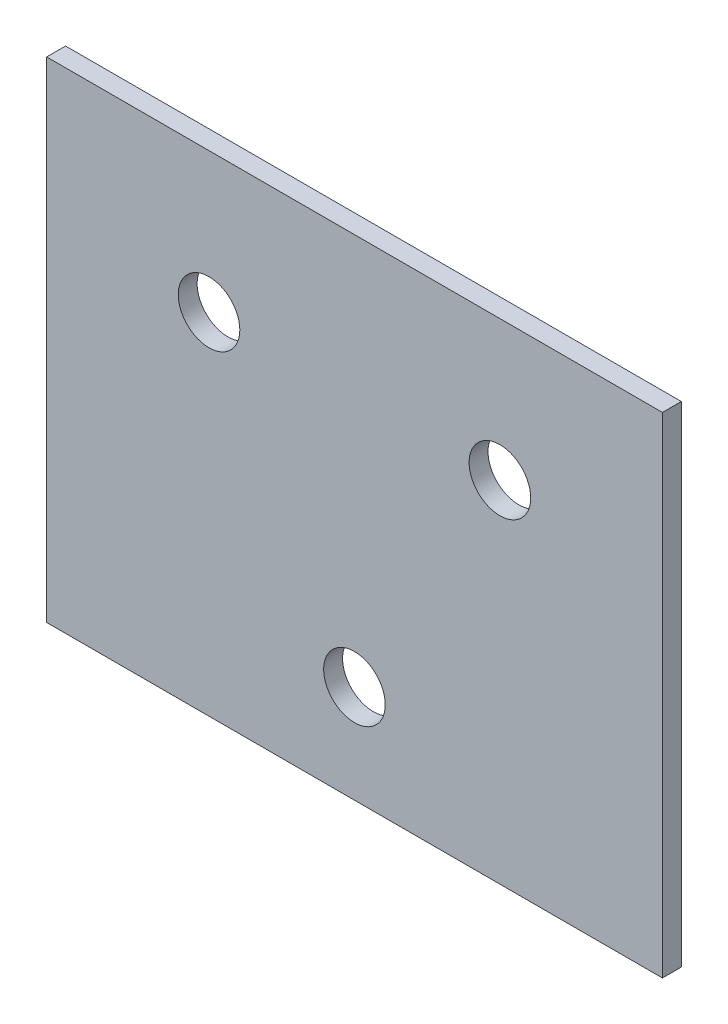
ISO-10303-21;
HEADER;
FILE_DESCRIPTION(('STEP AP214'),'2;1');
FILE_NAME('part.step','',(''),(''),'','','');
FILE_SCHEMA(('AUTOMOTIVE_DESIGN { 1 0 10303 214 1 1 1 1 }'));
ENDSEC;
DATA;
#1=APPLICATION_CONTEXT('core data for automotive mechanical design processes');
#2=APPLICATION_PROTOCOL_DEFINITION('international standard','automotive_design',2000,#1);
#3=PRODUCT_CONTEXT('',#1,'mechanical');
#4=PRODUCT('Part','Part','',(#3));
#5=PRODUCT_RELATED_PRODUCT_CATEGORY('part','',(#4));
#6=PRODUCT_DEFINITION_FORMATION('','',#4);
#7=PRODUCT_DEFINITION_CONTEXT('part definition',#1,'design');
#8=PRODUCT_DEFINITION('design','',#6,#7);
#9=PRODUCT_DEFINITION_SHAPE('','',#8);
#10=(LENGTH_UNIT() NAMED_UNIT(*) SI_UNIT(.MILLI.,.METRE.));
#11=(NAMED_UNIT(*) PLANE_ANGLE_UNIT() SI_UNIT($,.RADIAN.));
#12=(NAMED_UNIT(*) SI_UNIT($,.STERADIAN.) SOLID_ANGLE_UNIT());
#13=UNCERTAINTY_MEASURE_WITH_UNIT(LENGTH_MEASURE(1.E-05),#10,'distance_accuracy_value','');
#14=(GEOMETRIC_REPRESENTATION_CONTEXT(3) GLOBAL_UNCERTAINTY_ASSIGNED_CONTEXT((#13)) GLOBAL_UNIT_ASSIGNED_CONTEXT((#10,
#11,#12)) REPRESENTATION_CONTEXT('',''));
#15=CARTESIAN_POINT('',(0.,0.,0.));
#16=DIRECTION('',(0.,0.,1.));
#17=DIRECTION('',(1.,0.,0.));
#18=AXIS2_PLACEMENT_3D('',#15,#16,#17);
#19=CARTESIAN_POINT('',(-569.776309556896,0.,6.75));
#20=DIRECTION('',(-1.,0.,0.));
#21=DIRECTION('',(0.,0.,1.));
#22=AXIS2_PLACEMENT_3D('',#19,#20,#21);
#23=PLANE('',#22);
#24=DIRECTION('',(0.,1.,0.));
#25=VECTOR('',#24,1.);
#26=CARTESIAN_POINT('',(-569.776309556896,0.,0.));
#27=LINE('',#26,#25);
#28=CARTESIAN_POINT('',(-569.776309556896,-297.585944493686,0.));
#29=VERTEX_POINT('',#28);
#30=CARTESIAN_POINT('',(-569.776309556896,-122.585944493686,0.));
#31=VERTEX_POINT('',#30);
#32=EDGE_CURVE('E112',#29,#31,#27,.T.);
#33=ORIENTED_EDGE('',*,*,#32,.F.);
#34=DIRECTION('',(0.,0.,-1.));
#35=VECTOR('',#34,1.);
#36=CARTESIAN_POINT('',(-569.776309556896,-297.585944493686,6.75));
#37=LINE('',#36,#35);
#38=CARTESIAN_POINT('',(-569.776309556896,-297.585944493686,6.75));
#39=VERTEX_POINT('',#38);
#40=EDGE_CURVE('E11',#39,#29,#37,.T.);
#41=ORIENTED_EDGE('',*,*,#40,.F.);
#42=DIRECTION('',(0.,1.,0.));
#43=VECTOR('',#42,1.);
#44=CARTESIAN_POINT('',(-569.776309556896,0.,6.75));
#45=LINE('',#44,#43);
#46=CARTESIAN_POINT('',(-569.776309556896,-122.585944493686,6.75));
#47=VERTEX_POINT('',#46);
#48=EDGE_CURVE('E95',#39,#47,#45,.T.);
#49=ORIENTED_EDGE('',*,*,#48,.T.);
#50=DIRECTION('',(0.,0.,-1.));
#51=VECTOR('',#50,1.);
#52=CARTESIAN_POINT('',(-569.776309556896,-122.585944493686,6.75));
#53=LINE('',#52,#51);
#54=EDGE_CURVE('E56',#47,#31,#53,.T.);
#55=ORIENTED_EDGE('',*,*,#54,.T.);
#56=EDGE_LOOP('',(#33,#41,#49,#55));
#57=FACE_BOUND('',#56,.T.);
#58=ADVANCED_FACE('F39',(#57),#23,.T.);
#59=CARTESIAN_POINT('',(0.,-297.585944493686,6.75));
#60=DIRECTION('',(0.,-1.,0.));
#61=DIRECTION('',(0.,0.,-1.));
#62=AXIS2_PLACEMENT_3D('',#59,#60,#61);
#63=PLANE('',#62);
#64=DIRECTION('',(-1.,0.,0.));
#65=VECTOR('',#64,1.);
#66=CARTESIAN_POINT('',(0.,-297.585944493686,0.));
#67=LINE('',#66,#65);
#68=CARTESIAN_POINT('',(-349.776309556902,-297.585944493686,0.));
#69=VERTEX_POINT('',#68);
#70=EDGE_CURVE('E86',#69,#29,#67,.T.);
#71=ORIENTED_EDGE('',*,*,#70,.F.);
#72=DIRECTION('',(0.,0.,-1.));
#73=VECTOR('',#72,1.);
#74=CARTESIAN_POINT('',(-349.776309556902,-297.585944493686,6.75));
#75=LINE('',#74,#73);
#76=CARTESIAN_POINT('',(-349.776309556902,-297.585944493686,6.75));
#77=VERTEX_POINT('',#76);
#78=EDGE_CURVE('E48',#77,#69,#75,.T.);
#79=ORIENTED_EDGE('',*,*,#78,.F.);
#80=DIRECTION('',(-1.,0.,0.));
#81=VECTOR('',#80,1.);
#82=CARTESIAN_POINT('',(0.,-297.585944493686,6.75));
#83=LINE('',#82,#81);
#84=EDGE_CURVE('E84',#77,#39,#83,.T.);
#85=ORIENTED_EDGE('',*,*,#84,.T.);
#86=ORIENTED_EDGE('',*,*,#40,.T.);
#87=EDGE_LOOP('',(#71,#79,#85,#86));
#88=FACE_BOUND('',#87,.T.);
#89=ADVANCED_FACE('F83',(#88),#63,.T.);
#90=CARTESIAN_POINT('',(-349.776309556903,-1.10951346382425E-13,6.75));
#91=DIRECTION('',(1.,0.,0.));
#92=DIRECTION('',(0.,1.,0.));
#93=AXIS2_PLACEMENT_3D('',#90,#91,#92);
#94=PLANE('',#93);
#95=DIRECTION('',(0.,-1.,0.));
#96=VECTOR('',#95,1.);
#97=CARTESIAN_POINT('',(-349.776309556903,-1.10951346382425E-13,0.));
#98=LINE('',#97,#96);
#99=CARTESIAN_POINT('',(-349.776309556902,-122.585944493686,0.));
#100=VERTEX_POINT('',#99);
#101=EDGE_CURVE('E115',#100,#69,#98,.T.);
#102=ORIENTED_EDGE('',*,*,#101,.F.);
#103=DIRECTION('',(0.,0.,-1.));
#104=VECTOR('',#103,1.);
#105=CARTESIAN_POINT('',(-349.776309556902,-122.585944493686,6.75));
#106=LINE('',#105,#104);
#107=CARTESIAN_POINT('',(-349.776309556902,-122.585944493686,6.75));
#108=VERTEX_POINT('',#107);
#109=EDGE_CURVE('E69',#108,#100,#106,.T.);
#110=ORIENTED_EDGE('',*,*,#109,.F.);
#111=DIRECTION('',(0.,-1.,0.));
#112=VECTOR('',#111,1.);
#113=CARTESIAN_POINT('',(-349.776309556903,-1.10951346382425E-13,6.75));
#114=LINE('',#113,#112);
#115=EDGE_CURVE('E94',#108,#77,#114,.T.);
#116=ORIENTED_EDGE('',*,*,#115,.T.);
#117=ORIENTED_EDGE('',*,*,#78,.T.);
#118=EDGE_LOOP('',(#102,#110,#116,#117));
#119=FACE_BOUND('',#118,.T.);
#120=ADVANCED_FACE('F97',(#119),#94,.T.);
#121=CARTESIAN_POINT('',(-511.769394754935,-172.585944493686,6.75));
#122=DIRECTION('',(0.,0.,-1.));
#123=DIRECTION('',(-1.,0.,0.));
#124=AXIS2_PLACEMENT_3D('',#121,#122,#123);
#125=CYLINDRICAL_SURFACE('',#124,11.);
#126=CARTESIAN_POINT('',(-511.769394754935,-172.585944493686,6.75));
#127=DIRECTION('',(0.,0.,1.));
#128=DIRECTION('',(1.,0.,0.));
#129=AXIS2_PLACEMENT_3D('',#126,#127,#128);
#130=CIRCLE('',#129,11.);
#131=CARTESIAN_POINT('',(-500.769394754935,-172.585944493686,6.75));
#132=VERTEX_POINT('',#131);
#133=EDGE_CURVE('E129',#132,#132,#130,.T.);
#134=ORIENTED_EDGE('',*,*,#133,.T.);
#135=EDGE_LOOP('',(#134));
#136=FACE_BOUND('',#135,.T.);
#137=CARTESIAN_POINT('',(-511.769394754935,-172.585944493686,0.));
#138=DIRECTION('',(0.,0.,1.));
#139=DIRECTION('',(1.,0.,0.));
#140=AXIS2_PLACEMENT_3D('',#137,#138,#139);
#141=CIRCLE('',#140,11.);
#142=CARTESIAN_POINT('',(-500.769394754935,-172.585944493686,0.));
#143=VERTEX_POINT('',#142);
#144=EDGE_CURVE('E109',#143,#143,#141,.T.);
#145=ORIENTED_EDGE('',*,*,#144,.F.);
#146=EDGE_LOOP('',(#145));
#147=FACE_BOUND('',#146,.T.);
#148=ADVANCED_FACE('F153',(#136,#147),#125,.F.);
#149=CARTESIAN_POINT('',(-407.846346300803,-172.585944493692,6.75));
#150=DIRECTION('',(0.,0.,-1.));
#151=DIRECTION('',(-1.,0.,0.));
#152=AXIS2_PLACEMENT_3D('',#149,#150,#151);
#153=CYLINDRICAL_SURFACE('',#152,11.0000000000008);
#154=CARTESIAN_POINT('',(-407.846346300803,-172.585944493692,6.75));
#155=DIRECTION('',(0.,0.,1.));
#156=DIRECTION('',(1.,0.,0.));
#157=AXIS2_PLACEMENT_3D('',#154,#155,#156);
#158=CIRCLE('',#157,11.0000000000008);
#159=CARTESIAN_POINT('',(-396.846346300802,-172.585944493692,6.75));
#160=VERTEX_POINT('',#159);
#161=EDGE_CURVE('E124',#160,#160,#158,.T.);
#162=ORIENTED_EDGE('',*,*,#161,.T.);
#163=EDGE_LOOP('',(#162));
#164=FACE_BOUND('',#163,.T.);
#165=CARTESIAN_POINT('',(-407.846346300803,-172.585944493692,0.));
#166=DIRECTION('',(0.,0.,1.));
#167=DIRECTION('',(1.,0.,0.));
#168=AXIS2_PLACEMENT_3D('',#165,#166,#167);
#169=CIRCLE('',#168,11.0000000000008);
#170=CARTESIAN_POINT('',(-396.846346300802,-172.585944493692,0.));
#171=VERTEX_POINT('',#170);
#172=EDGE_CURVE('E106',#171,#171,#169,.T.);
#173=ORIENTED_EDGE('',*,*,#172,.F.);
#174=EDGE_LOOP('',(#173));
#175=FACE_BOUND('',#174,.T.);
#176=ADVANCED_FACE('F143',(#164,#175),#153,.F.);
#177=CARTESIAN_POINT('',(-459.807870527874,-262.585944493689,6.75));
#178=DIRECTION('',(0.,0.,-1.));
#179=DIRECTION('',(-1.,0.,0.));
#180=AXIS2_PLACEMENT_3D('',#177,#178,#179);
#181=CYLINDRICAL_SURFACE('',#180,11.);
#182=CARTESIAN_POINT('',(-459.807870527874,-262.585944493689,6.75));
#183=DIRECTION('',(0.,0.,1.));
#184=DIRECTION('',(1.,0.,0.));
#185=AXIS2_PLACEMENT_3D('',#182,#183,#184);
#186=CIRCLE('',#185,11.);
#187=CARTESIAN_POINT('',(-448.807870527875,-262.585944493689,6.75));
#188=VERTEX_POINT('',#187);
#189=EDGE_CURVE('E120',#188,#188,#186,.T.);
#190=ORIENTED_EDGE('',*,*,#189,.T.);
#191=EDGE_LOOP('',(#190));
#192=FACE_BOUND('',#191,.T.);
#193=CARTESIAN_POINT('',(-459.807870527874,-262.585944493689,0.));
#194=DIRECTION('',(0.,0.,1.));
#195=DIRECTION('',(1.,0.,0.));
#196=AXIS2_PLACEMENT_3D('',#193,#194,#195);
#197=CIRCLE('',#196,11.);
#198=CARTESIAN_POINT('',(-448.807870527875,-262.585944493689,0.));
#199=VERTEX_POINT('',#198);
#200=EDGE_CURVE('E103',#199,#199,#197,.T.);
#201=ORIENTED_EDGE('',*,*,#200,.F.);
#202=EDGE_LOOP('',(#201));
#203=FACE_BOUND('',#202,.T.);
#204=ADVANCED_FACE('F41',(#192,#203),#181,.F.);
#205=CARTESIAN_POINT('',(0.,-122.585944493686,6.75));
#206=DIRECTION('',(0.,1.,0.));
#207=DIRECTION('',(0.,0.,1.));
#208=AXIS2_PLACEMENT_3D('',#205,#206,#207);
#209=PLANE('',#208);
#210=DIRECTION('',(1.,0.,0.));
#211=VECTOR('',#210,1.);
#212=CARTESIAN_POINT('',(0.,-122.585944493686,0.));
#213=LINE('',#212,#211);
#214=EDGE_CURVE('E117',#31,#100,#213,.T.);
#215=ORIENTED_EDGE('',*,*,#214,.F.);
#216=ORIENTED_EDGE('',*,*,#54,.F.);
#217=DIRECTION('',(1.,0.,0.));
#218=VECTOR('',#217,1.);
#219=CARTESIAN_POINT('',(0.,-122.585944493686,6.75));
#220=LINE('',#219,#218);
#221=EDGE_CURVE('E98',#47,#108,#220,.T.);
#222=ORIENTED_EDGE('',*,*,#221,.T.);
#223=ORIENTED_EDGE('',*,*,#109,.T.);
#224=EDGE_LOOP('',(#215,#216,#222,#223));
#225=FACE_BOUND('',#224,.T.);
#226=ADVANCED_FACE('F133',(#225),#209,.T.);
#227=CARTESIAN_POINT('',(0.,0.,6.75));
#228=DIRECTION('',(0.,0.,1.));
#229=DIRECTION('',(1.,0.,0.));
#230=AXIS2_PLACEMENT_3D('',#227,#228,#229);
#231=PLANE('',#230);
#232=ORIENTED_EDGE('',*,*,#189,.F.);
#233=EDGE_LOOP('',(#232));
#234=FACE_BOUND('',#233,.T.);
#235=ORIENTED_EDGE('',*,*,#161,.F.);
#236=EDGE_LOOP('',(#235));
#237=FACE_BOUND('',#236,.T.);
#238=ORIENTED_EDGE('',*,*,#133,.F.);
#239=EDGE_LOOP('',(#238));
#240=FACE_BOUND('',#239,.T.);
#241=ORIENTED_EDGE('',*,*,#48,.F.);
#242=ORIENTED_EDGE('',*,*,#84,.F.);
#243=ORIENTED_EDGE('',*,*,#115,.F.);
#244=ORIENTED_EDGE('',*,*,#221,.F.);
#245=EDGE_LOOP('',(#241,#242,#243,#244));
#246=FACE_BOUND('',#245,.T.);
#247=ADVANCED_FACE('F92',(#234,#237,#240,#246),#231,.T.);
#248=CARTESIAN_POINT('',(0.,0.,0.));
#249=DIRECTION('',(0.,0.,1.));
#250=DIRECTION('',(1.,0.,0.));
#251=AXIS2_PLACEMENT_3D('',#248,#249,#250);
#252=PLANE('',#251);
#253=ORIENTED_EDGE('',*,*,#200,.T.);
#254=EDGE_LOOP('',(#253));
#255=FACE_BOUND('',#254,.T.);
#256=ORIENTED_EDGE('',*,*,#172,.T.);
#257=EDGE_LOOP('',(#256));
#258=FACE_BOUND('',#257,.T.);
#259=ORIENTED_EDGE('',*,*,#144,.T.);
#260=EDGE_LOOP('',(#259));
#261=FACE_BOUND('',#260,.T.);
#262=ORIENTED_EDGE('',*,*,#32,.T.);
#263=ORIENTED_EDGE('',*,*,#214,.T.);
#264=ORIENTED_EDGE('',*,*,#101,.T.);
#265=ORIENTED_EDGE('',*,*,#70,.T.);
#266=EDGE_LOOP('',(#262,#263,#264,#265));
#267=FACE_BOUND('',#266,.T.);
#268=ADVANCED_FACE('F140',(#255,#258,#261,#267),#252,.F.);
#269=CLOSED_SHELL('',(#58,#89,#120,#148,#176,#204,#226,#247,#268));
#270=MANIFOLD_SOLID_BREP('B2',#269);
#271=ADVANCED_BREP_SHAPE_REPRESENTATION('',(#18,#270),#14);
#272=SHAPE_DEFINITION_REPRESENTATION(#9,#271);
ENDSEC;
END-ISO-10303-21;
